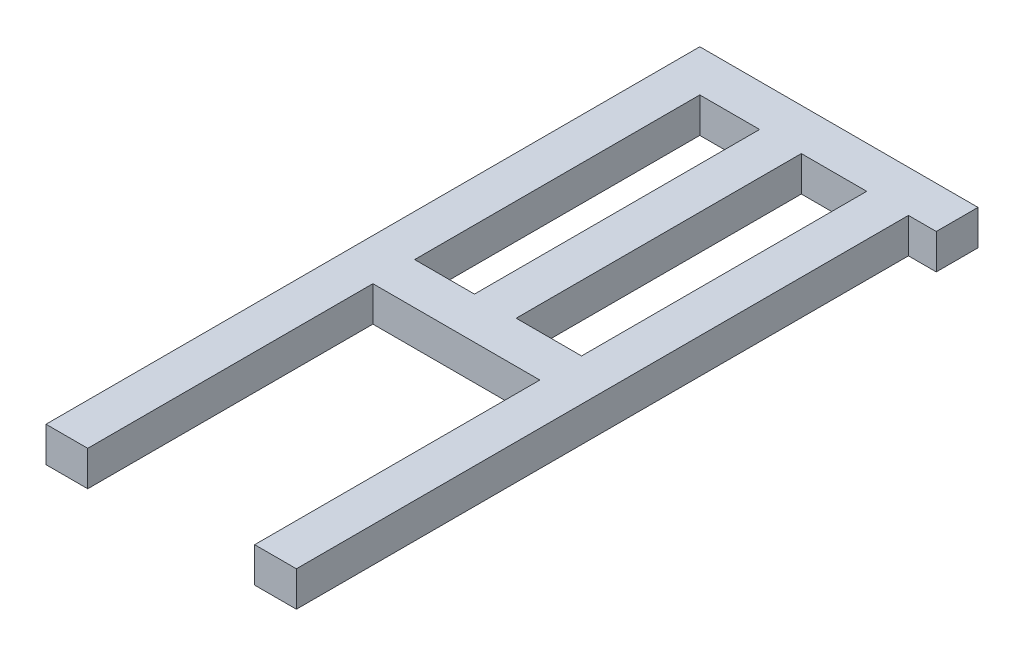
ISO-10303-21;
HEADER;
FILE_DESCRIPTION(('STEP AP214'),'2;1');
FILE_NAME('part.step','',(''),(''),'','','');
FILE_SCHEMA(('AUTOMOTIVE_DESIGN { 1 0 10303 214 1 1 1 1 }'));
ENDSEC;
DATA;
#1=APPLICATION_CONTEXT('core data for automotive mechanical design processes');
#2=APPLICATION_PROTOCOL_DEFINITION('international standard','automotive_design',2000,#1);
#3=PRODUCT_CONTEXT('',#1,'mechanical');
#4=PRODUCT('Part','Part','',(#3));
#5=PRODUCT_RELATED_PRODUCT_CATEGORY('part','',(#4));
#6=PRODUCT_DEFINITION_FORMATION('','',#4);
#7=PRODUCT_DEFINITION_CONTEXT('part definition',#1,'design');
#8=PRODUCT_DEFINITION('design','',#6,#7);
#9=PRODUCT_DEFINITION_SHAPE('','',#8);
#10=(LENGTH_UNIT() NAMED_UNIT(*) SI_UNIT(.MILLI.,.METRE.));
#11=(NAMED_UNIT(*) PLANE_ANGLE_UNIT() SI_UNIT($,.RADIAN.));
#12=(NAMED_UNIT(*) SI_UNIT($,.STERADIAN.) SOLID_ANGLE_UNIT());
#13=UNCERTAINTY_MEASURE_WITH_UNIT(LENGTH_MEASURE(1.E-05),#10,'distance_accuracy_value','');
#14=(GEOMETRIC_REPRESENTATION_CONTEXT(3) GLOBAL_UNCERTAINTY_ASSIGNED_CONTEXT((#13)) GLOBAL_UNIT_ASSIGNED_CONTEXT((#10,
#11,#12)) REPRESENTATION_CONTEXT('',''));
#15=CARTESIAN_POINT('',(0.,0.,0.));
#16=DIRECTION('',(0.,0.,1.));
#17=DIRECTION('',(1.,0.,0.));
#18=AXIS2_PLACEMENT_3D('',#15,#16,#17);
#19=CARTESIAN_POINT('',(500000.,0.,512.5));
#20=DIRECTION('',(0.,0.,-1.));
#21=DIRECTION('',(-1.,0.,0.));
#22=AXIS2_PLACEMENT_3D('',#19,#20,#21);
#23=PLANE('',#22);
#24=DIRECTION('',(-1.,0.,0.));
#25=VECTOR('',#24,1.);
#26=CARTESIAN_POINT('',(500000.,0.,512.5));
#27=LINE('',#26,#25);
#28=CARTESIAN_POINT('',(0.,0.,512.5));
#29=VERTEX_POINT('',#28);
#30=CARTESIAN_POINT('',(-117.5,0.,512.5));
#31=VERTEX_POINT('',#30);
#32=EDGE_CURVE('E260',#29,#31,#27,.T.);
#33=ORIENTED_EDGE('',*,*,#32,.T.);
#34=DIRECTION('',(0.,1.,0.));
#35=VECTOR('',#34,1.);
#36=CARTESIAN_POINT('',(-117.5,0.,512.5));
#37=LINE('',#36,#35);
#38=CARTESIAN_POINT('',(-117.5,63.,512.5));
#39=VERTEX_POINT('',#38);
#40=EDGE_CURVE('E202',#31,#39,#37,.T.);
#41=ORIENTED_EDGE('',*,*,#40,.T.);
#42=DIRECTION('',(-1.,0.,0.));
#43=VECTOR('',#42,1.);
#44=CARTESIAN_POINT('',(500000.,63.,512.5));
#45=LINE('',#44,#43);
#46=CARTESIAN_POINT('',(0.,63.,512.5));
#47=VERTEX_POINT('',#46);
#48=EDGE_CURVE('E256',#47,#39,#45,.T.);
#49=ORIENTED_EDGE('',*,*,#48,.F.);
#50=DIRECTION('',(0.,-1.,0.));
#51=VECTOR('',#50,1.);
#52=CARTESIAN_POINT('',(0.,0.,512.5));
#53=LINE('',#52,#51);
#54=EDGE_CURVE('E56',#47,#29,#53,.T.);
#55=ORIENTED_EDGE('',*,*,#54,.T.);
#56=EDGE_LOOP('',(#33,#41,#49,#55));
#57=FACE_BOUND('',#56,.T.);
#58=ADVANCED_FACE('F33',(#57),#23,.T.);
#59=CARTESIAN_POINT('',(-192.5,63.,512.5));
#60=VERTEX_POINT('',#59);
#61=CARTESIAN_POINT('',(-299.999999999955,63.,512.5));
#62=VERTEX_POINT('',#61);
#63=EDGE_CURVE('E259',#60,#62,#45,.T.);
#64=ORIENTED_EDGE('',*,*,#63,.F.);
#65=DIRECTION('',(0.,-1.,0.));
#66=VECTOR('',#65,1.);
#67=CARTESIAN_POINT('',(-192.5,0.,512.5));
#68=LINE('',#67,#66);
#69=CARTESIAN_POINT('',(-192.499999999995,0.,512.5));
#70=VERTEX_POINT('',#69);
#71=EDGE_CURVE('E205',#60,#70,#68,.T.);
#72=ORIENTED_EDGE('',*,*,#71,.T.);
#73=CARTESIAN_POINT('',(-300.,0.,512.5));
#74=VERTEX_POINT('',#73);
#75=EDGE_CURVE('E249',#70,#74,#27,.T.);
#76=ORIENTED_EDGE('',*,*,#75,.T.);
#77=DIRECTION('',(0.,-1.,0.));
#78=VECTOR('',#77,1.);
#79=CARTESIAN_POINT('',(-300.000000000011,1.10075188885363E-10,512.5));
#80=LINE('',#79,#78);
#81=EDGE_CURVE('E245',#62,#74,#80,.T.);
#82=ORIENTED_EDGE('',*,*,#81,.F.);
#83=EDGE_LOOP('',(#64,#72,#76,#82));
#84=FACE_BOUND('',#83,.T.);
#85=ADVANCED_FACE('F318',(#84),#23,.T.);
#86=CARTESIAN_POINT('',(0.,0.,1100.));
#87=DIRECTION('',(1.,0.,0.));
#88=DIRECTION('',(0.,0.,-1.));
#89=AXIS2_PLACEMENT_3D('',#86,#87,#88);
#90=PLANE('',#89);
#91=ORIENTED_EDGE('',*,*,#54,.F.);
#92=DIRECTION('',(0.,0.,-1.));
#93=VECTOR('',#92,1.);
#94=CARTESIAN_POINT('',(0.,63.,1100.));
#95=LINE('',#94,#93);
#96=CARTESIAN_POINT('',(0.,63.,0.));
#97=VERTEX_POINT('',#96);
#98=EDGE_CURVE('E278',#47,#97,#95,.T.);
#99=ORIENTED_EDGE('',*,*,#98,.T.);
#100=DIRECTION('',(0.,-1.,0.));
#101=VECTOR('',#100,1.);
#102=CARTESIAN_POINT('',(0.,0.,0.));
#103=LINE('',#102,#101);
#104=CARTESIAN_POINT('',(0.,0.,0.));
#105=VERTEX_POINT('',#104);
#106=EDGE_CURVE('E267',#97,#105,#103,.T.);
#107=ORIENTED_EDGE('',*,*,#106,.T.);
#108=DIRECTION('',(0.,0.,-1.));
#109=VECTOR('',#108,1.);
#110=CARTESIAN_POINT('',(0.,0.,1100.));
#111=LINE('',#110,#109);
#112=EDGE_CURVE('E41',#29,#105,#111,.T.);
#113=ORIENTED_EDGE('',*,*,#112,.F.);
#114=EDGE_LOOP('',(#91,#99,#107,#113));
#115=FACE_BOUND('',#114,.T.);
#116=ADVANCED_FACE('F35',(#115),#90,.F.);
#117=DIRECTION('',(0.,1.,0.));
#118=VECTOR('',#117,1.);
#119=CARTESIAN_POINT('',(0.,0.,587.5));
#120=LINE('',#119,#118);
#121=CARTESIAN_POINT('',(0.,0.,587.5));
#122=VERTEX_POINT('',#121);
#123=CARTESIAN_POINT('',(0.,63.,587.5));
#124=VERTEX_POINT('',#123);
#125=EDGE_CURVE('E264',#122,#124,#120,.T.);
#126=ORIENTED_EDGE('',*,*,#125,.F.);
#127=CARTESIAN_POINT('',(0.,0.,1100.));
#128=VERTEX_POINT('',#127);
#129=EDGE_CURVE('E11',#128,#122,#111,.T.);
#130=ORIENTED_EDGE('',*,*,#129,.F.);
#131=DIRECTION('',(0.,-1.,0.));
#132=VECTOR('',#131,1.);
#133=CARTESIAN_POINT('',(0.,0.,1100.));
#134=LINE('',#133,#132);
#135=CARTESIAN_POINT('',(0.,63.,1100.));
#136=VERTEX_POINT('',#135);
#137=EDGE_CURVE('E268',#136,#128,#134,.T.);
#138=ORIENTED_EDGE('',*,*,#137,.F.);
#139=EDGE_CURVE('E283',#136,#124,#95,.T.);
#140=ORIENTED_EDGE('',*,*,#139,.T.);
#141=EDGE_LOOP('',(#126,#130,#138,#140));
#142=FACE_BOUND('',#141,.T.);
#143=ADVANCED_FACE('F325',(#142),#90,.F.);
#144=CARTESIAN_POINT('',(0.,0.,1100.));
#145=DIRECTION('',(0.,1.,0.));
#146=DIRECTION('',(0.,0.,1.));
#147=AXIS2_PLACEMENT_3D('',#144,#145,#146);
#148=PLANE('',#147);
#149=DIRECTION('',(-1.,0.,0.));
#150=VECTOR('',#149,1.);
#151=CARTESIAN_POINT('',(125.,0.,0.));
#152=LINE('',#151,#150);
#153=CARTESIAN_POINT('',(125.,0.,0.));
#154=VERTEX_POINT('',#153);
#155=CARTESIAN_POINT('',(75.,0.,0.));
#156=VERTEX_POINT('',#155);
#157=EDGE_CURVE('E197',#154,#156,#152,.T.);
#158=ORIENTED_EDGE('',*,*,#157,.T.);
#159=DIRECTION('',(0.,0.,-1.));
#160=VECTOR('',#159,1.);
#161=CARTESIAN_POINT('',(75.,0.,1100.));
#162=LINE('',#161,#160);
#163=CARTESIAN_POINT('',(75.,0.,1100.));
#164=VERTEX_POINT('',#163);
#165=EDGE_CURVE('E286',#164,#156,#162,.T.);
#166=ORIENTED_EDGE('',*,*,#165,.F.);
#167=DIRECTION('',(1.,0.,0.));
#168=VECTOR('',#167,1.);
#169=CARTESIAN_POINT('',(0.,0.,1100.));
#170=LINE('',#169,#168);
#171=EDGE_CURVE('E271',#128,#164,#170,.T.);
#172=ORIENTED_EDGE('',*,*,#171,.F.);
#173=ORIENTED_EDGE('',*,*,#129,.T.);
#174=DIRECTION('',(-1.,0.,0.));
#175=VECTOR('',#174,1.);
#176=CARTESIAN_POINT('',(500000.,0.,587.5));
#177=LINE('',#176,#175);
#178=CARTESIAN_POINT('',(-299.999999999955,0.,587.5));
#179=VERTEX_POINT('',#178);
#180=EDGE_CURVE('E252',#122,#179,#177,.T.);
#181=ORIENTED_EDGE('',*,*,#180,.T.);
#182=DIRECTION('',(0.,0.,-1.));
#183=VECTOR('',#182,1.);
#184=CARTESIAN_POINT('',(-300.,0.,1100.));
#185=LINE('',#184,#183);
#186=CARTESIAN_POINT('',(-300.,0.,1100.));
#187=VERTEX_POINT('',#186);
#188=EDGE_CURVE('E240',#187,#179,#185,.T.);
#189=ORIENTED_EDGE('',*,*,#188,.F.);
#190=DIRECTION('',(1.,0.,0.));
#191=VECTOR('',#190,1.);
#192=CARTESIAN_POINT('',(-375.,0.,1100.));
#193=LINE('',#192,#191);
#194=CARTESIAN_POINT('',(-375.,0.,1100.));
#195=VERTEX_POINT('',#194);
#196=EDGE_CURVE('E225',#195,#187,#193,.T.);
#197=ORIENTED_EDGE('',*,*,#196,.F.);
#198=DIRECTION('',(0.,0.,-1.));
#199=VECTOR('',#198,1.);
#200=CARTESIAN_POINT('',(-375.,0.,1100.));
#201=LINE('',#200,#199);
#202=CARTESIAN_POINT('',(-375.,0.,-75.));
#203=VERTEX_POINT('',#202);
#204=EDGE_CURVE('E243',#195,#203,#201,.T.);
#205=ORIENTED_EDGE('',*,*,#204,.T.);
#206=DIRECTION('',(-1.,0.,0.));
#207=VECTOR('',#206,1.);
#208=CARTESIAN_POINT('',(125.,0.,-75.));
#209=LINE('',#208,#207);
#210=CARTESIAN_POINT('',(125.,0.,-75.));
#211=VERTEX_POINT('',#210);
#212=EDGE_CURVE('E172',#211,#203,#209,.T.);
#213=ORIENTED_EDGE('',*,*,#212,.F.);
#214=DIRECTION('',(0.,0.,-1.));
#215=VECTOR('',#214,1.);
#216=CARTESIAN_POINT('',(125.,0.,0.));
#217=LINE('',#216,#215);
#218=EDGE_CURVE('E180',#154,#211,#217,.T.);
#219=ORIENTED_EDGE('',*,*,#218,.F.);
#220=EDGE_LOOP('',(#158,#166,#172,#173,#181,#189,#197,#205,#213,#219));
#221=FACE_BOUND('',#220,.T.);
#222=CARTESIAN_POINT('',(-192.5,0.,0.));
#223=VERTEX_POINT('',#222);
#224=CARTESIAN_POINT('',(-300.,0.,0.));
#225=VERTEX_POINT('',#224);
#226=EDGE_CURVE('E200',#223,#225,#152,.T.);
#227=ORIENTED_EDGE('',*,*,#226,.T.);
#228=EDGE_CURVE('E239',#74,#225,#185,.T.);
#229=ORIENTED_EDGE('',*,*,#228,.F.);
#230=ORIENTED_EDGE('',*,*,#75,.F.);
#231=DIRECTION('',(0.,0.,-1.));
#232=VECTOR('',#231,1.);
#233=CARTESIAN_POINT('',(-192.5,0.,512.5));
#234=LINE('',#233,#232);
#235=EDGE_CURVE('E48',#70,#223,#234,.T.);
#236=ORIENTED_EDGE('',*,*,#235,.T.);
#237=EDGE_LOOP('',(#227,#229,#230,#236));
#238=FACE_BOUND('',#237,.T.);
#239=ORIENTED_EDGE('',*,*,#112,.T.);
#240=CARTESIAN_POINT('',(-117.5,0.,0.));
#241=VERTEX_POINT('',#240);
#242=EDGE_CURVE('E199',#105,#241,#152,.T.);
#243=ORIENTED_EDGE('',*,*,#242,.T.);
#244=DIRECTION('',(0.,0.,-1.));
#245=VECTOR('',#244,1.);
#246=CARTESIAN_POINT('',(-117.5,0.,512.5));
#247=LINE('',#246,#245);
#248=EDGE_CURVE('E218',#31,#241,#247,.T.);
#249=ORIENTED_EDGE('',*,*,#248,.F.);
#250=ORIENTED_EDGE('',*,*,#32,.F.);
#251=EDGE_LOOP('',(#239,#243,#249,#250));
#252=FACE_BOUND('',#251,.T.);
#253=ADVANCED_FACE('F294',(#221,#238,#252),#148,.F.);
#254=CARTESIAN_POINT('',(75.,0.,1100.));
#255=DIRECTION('',(-1.,0.,0.));
#256=DIRECTION('',(0.,-1.,0.));
#257=AXIS2_PLACEMENT_3D('',#254,#255,#256);
#258=PLANE('',#257);
#259=DIRECTION('',(0.,1.,0.));
#260=VECTOR('',#259,1.);
#261=CARTESIAN_POINT('',(75.,0.,0.));
#262=LINE('',#261,#260);
#263=CARTESIAN_POINT('',(75.,63.,0.));
#264=VERTEX_POINT('',#263);
#265=EDGE_CURVE('E272',#156,#264,#262,.T.);
#266=ORIENTED_EDGE('',*,*,#265,.T.);
#267=DIRECTION('',(0.,0.,-1.));
#268=VECTOR('',#267,1.);
#269=CARTESIAN_POINT('',(75.,63.,1100.));
#270=LINE('',#269,#268);
#271=CARTESIAN_POINT('',(75.,63.,1100.));
#272=VERTEX_POINT('',#271);
#273=EDGE_CURVE('E285',#272,#264,#270,.T.);
#274=ORIENTED_EDGE('',*,*,#273,.F.);
#275=DIRECTION('',(0.,1.,0.));
#276=VECTOR('',#275,1.);
#277=CARTESIAN_POINT('',(75.,0.,1100.));
#278=LINE('',#277,#276);
#279=EDGE_CURVE('E274',#164,#272,#278,.T.);
#280=ORIENTED_EDGE('',*,*,#279,.F.);
#281=ORIENTED_EDGE('',*,*,#165,.T.);
#282=EDGE_LOOP('',(#266,#274,#280,#281));
#283=FACE_BOUND('',#282,.T.);
#284=ADVANCED_FACE('F342',(#283),#258,.F.);
#285=CARTESIAN_POINT('',(0.,63.,1100.));
#286=DIRECTION('',(0.,-1.,0.));
#287=DIRECTION('',(0.,0.,-1.));
#288=AXIS2_PLACEMENT_3D('',#285,#286,#287);
#289=PLANE('',#288);
#290=DIRECTION('',(-1.,0.,0.));
#291=VECTOR('',#290,1.);
#292=CARTESIAN_POINT('',(125.,63.,0.));
#293=LINE('',#292,#291);
#294=CARTESIAN_POINT('',(-117.5,63.,0.));
#295=VERTEX_POINT('',#294);
#296=EDGE_CURVE('E195',#97,#295,#293,.T.);
#297=ORIENTED_EDGE('',*,*,#296,.F.);
#298=ORIENTED_EDGE('',*,*,#98,.F.);
#299=ORIENTED_EDGE('',*,*,#48,.T.);
#300=DIRECTION('',(0.,0.,-1.));
#301=VECTOR('',#300,1.);
#302=CARTESIAN_POINT('',(-117.5,63.,512.5));
#303=LINE('',#302,#301);
#304=EDGE_CURVE('E215',#39,#295,#303,.T.);
#305=ORIENTED_EDGE('',*,*,#304,.T.);
#306=EDGE_LOOP('',(#297,#298,#299,#305));
#307=FACE_BOUND('',#306,.T.);
#308=DIRECTION('',(-1.,0.,0.));
#309=VECTOR('',#308,1.);
#310=CARTESIAN_POINT('',(125.,63.,-75.));
#311=LINE('',#310,#309);
#312=CARTESIAN_POINT('',(125.,63.,-75.));
#313=VERTEX_POINT('',#312);
#314=CARTESIAN_POINT('',(-375.,63.,-75.));
#315=VERTEX_POINT('',#314);
#316=EDGE_CURVE('E162',#313,#315,#311,.T.);
#317=ORIENTED_EDGE('',*,*,#316,.T.);
#318=DIRECTION('',(0.,0.,-1.));
#319=VECTOR('',#318,1.);
#320=CARTESIAN_POINT('',(-375.,63.,1100.));
#321=LINE('',#320,#319);
#322=CARTESIAN_POINT('',(-375.,63.,1100.));
#323=VERTEX_POINT('',#322);
#324=EDGE_CURVE('E231',#323,#315,#321,.T.);
#325=ORIENTED_EDGE('',*,*,#324,.F.);
#326=DIRECTION('',(-1.,0.,0.));
#327=VECTOR('',#326,1.);
#328=CARTESIAN_POINT('',(-375.,63.,1100.));
#329=LINE('',#328,#327);
#330=CARTESIAN_POINT('',(-300.,63.,1100.));
#331=VERTEX_POINT('',#330);
#332=EDGE_CURVE('E229',#331,#323,#329,.T.);
#333=ORIENTED_EDGE('',*,*,#332,.F.);
#334=DIRECTION('',(0.,0.,-1.));
#335=VECTOR('',#334,1.);
#336=CARTESIAN_POINT('',(-300.,63.,1100.));
#337=LINE('',#336,#335);
#338=CARTESIAN_POINT('',(-300.000000000011,63.,587.5));
#339=VERTEX_POINT('',#338);
#340=EDGE_CURVE('E236',#331,#339,#337,.T.);
#341=ORIENTED_EDGE('',*,*,#340,.T.);
#342=DIRECTION('',(-1.,0.,0.));
#343=VECTOR('',#342,1.);
#344=CARTESIAN_POINT('',(500000.,63.,587.5));
#345=LINE('',#344,#343);
#346=EDGE_CURVE('E254',#124,#339,#345,.T.);
#347=ORIENTED_EDGE('',*,*,#346,.F.);
#348=ORIENTED_EDGE('',*,*,#139,.F.);
#349=DIRECTION('',(-1.,0.,0.));
#350=VECTOR('',#349,1.);
#351=CARTESIAN_POINT('',(0.,63.,1100.));
#352=LINE('',#351,#350);
#353=EDGE_CURVE('E276',#272,#136,#352,.T.);
#354=ORIENTED_EDGE('',*,*,#353,.F.);
#355=ORIENTED_EDGE('',*,*,#273,.T.);
#356=CARTESIAN_POINT('',(125.,63.,0.));
#357=VERTEX_POINT('',#356);
#358=EDGE_CURVE('E186',#357,#264,#293,.T.);
#359=ORIENTED_EDGE('',*,*,#358,.F.);
#360=DIRECTION('',(0.,0.,-1.));
#361=VECTOR('',#360,1.);
#362=CARTESIAN_POINT('',(125.,63.,0.));
#363=LINE('',#362,#361);
#364=EDGE_CURVE('E178',#357,#313,#363,.T.);
#365=ORIENTED_EDGE('',*,*,#364,.T.);
#366=EDGE_LOOP('',(#317,#325,#333,#341,#347,#348,#354,#355,#359,#365));
#367=FACE_BOUND('',#366,.T.);
#368=CARTESIAN_POINT('',(-300.,63.,0.));
#369=VERTEX_POINT('',#368);
#370=EDGE_CURVE('E235',#62,#369,#337,.T.);
#371=ORIENTED_EDGE('',*,*,#370,.T.);
#372=CARTESIAN_POINT('',(-192.5,63.,0.));
#373=VERTEX_POINT('',#372);
#374=EDGE_CURVE('E196',#373,#369,#293,.T.);
#375=ORIENTED_EDGE('',*,*,#374,.F.);
#376=DIRECTION('',(0.,0.,-1.));
#377=VECTOR('',#376,1.);
#378=CARTESIAN_POINT('',(-192.5,63.,512.5));
#379=LINE('',#378,#377);
#380=EDGE_CURVE('E212',#60,#373,#379,.T.);
#381=ORIENTED_EDGE('',*,*,#380,.F.);
#382=ORIENTED_EDGE('',*,*,#63,.T.);
#383=EDGE_LOOP('',(#371,#375,#381,#382));
#384=FACE_BOUND('',#383,.T.);
#385=ADVANCED_FACE('F183',(#307,#367,#384),#289,.F.);
#386=CARTESIAN_POINT('',(0.,0.,1100.));
#387=DIRECTION('',(0.,0.,-1.));
#388=DIRECTION('',(-1.,0.,0.));
#389=AXIS2_PLACEMENT_3D('',#386,#387,#388);
#390=PLANE('',#389);
#391=ORIENTED_EDGE('',*,*,#137,.T.);
#392=ORIENTED_EDGE('',*,*,#171,.T.);
#393=ORIENTED_EDGE('',*,*,#279,.T.);
#394=ORIENTED_EDGE('',*,*,#353,.T.);
#395=EDGE_LOOP('',(#391,#392,#393,#394));
#396=FACE_BOUND('',#395,.T.);
#397=ADVANCED_FACE('F335',(#396),#390,.F.);
#398=CARTESIAN_POINT('',(500000.,0.,587.5));
#399=DIRECTION('',(0.,0.,1.));
#400=DIRECTION('',(1.,0.,0.));
#401=AXIS2_PLACEMENT_3D('',#398,#399,#400);
#402=PLANE('',#401);
#403=ORIENTED_EDGE('',*,*,#180,.F.);
#404=ORIENTED_EDGE('',*,*,#125,.T.);
#405=ORIENTED_EDGE('',*,*,#346,.T.);
#406=DIRECTION('',(0.,1.,0.));
#407=VECTOR('',#406,1.);
#408=CARTESIAN_POINT('',(-300.000000000011,1.10079680799543E-10,587.5));
#409=LINE('',#408,#407);
#410=EDGE_CURVE('E246',#179,#339,#409,.T.);
#411=ORIENTED_EDGE('',*,*,#410,.F.);
#412=EDGE_LOOP('',(#403,#404,#405,#411));
#413=FACE_BOUND('',#412,.T.);
#414=ADVANCED_FACE('F331',(#413),#402,.T.);
#415=CARTESIAN_POINT('',(-300.,0.,1100.));
#416=DIRECTION('',(-1.,0.,0.));
#417=DIRECTION('',(0.,-1.,0.));
#418=AXIS2_PLACEMENT_3D('',#415,#416,#417);
#419=PLANE('',#418);
#420=ORIENTED_EDGE('',*,*,#188,.T.);
#421=ORIENTED_EDGE('',*,*,#410,.T.);
#422=ORIENTED_EDGE('',*,*,#340,.F.);
#423=DIRECTION('',(0.,1.,0.));
#424=VECTOR('',#423,1.);
#425=CARTESIAN_POINT('',(-300.,0.,1100.));
#426=LINE('',#425,#424);
#427=EDGE_CURVE('E227',#187,#331,#426,.T.);
#428=ORIENTED_EDGE('',*,*,#427,.F.);
#429=EDGE_LOOP('',(#420,#421,#422,#428));
#430=FACE_BOUND('',#429,.T.);
#431=ADVANCED_FACE('F334',(#430),#419,.F.);
#432=ORIENTED_EDGE('',*,*,#370,.F.);
#433=ORIENTED_EDGE('',*,*,#81,.T.);
#434=ORIENTED_EDGE('',*,*,#228,.T.);
#435=DIRECTION('',(0.,1.,0.));
#436=VECTOR('',#435,1.);
#437=CARTESIAN_POINT('',(-300.,0.,0.));
#438=LINE('',#437,#436);
#439=EDGE_CURVE('E221',#225,#369,#438,.T.);
#440=ORIENTED_EDGE('',*,*,#439,.T.);
#441=EDGE_LOOP('',(#432,#433,#434,#440));
#442=FACE_BOUND('',#441,.T.);
#443=ADVANCED_FACE('F312',(#442),#419,.F.);
#444=CARTESIAN_POINT('',(-375.,0.,1100.));
#445=DIRECTION('',(1.,0.,0.));
#446=DIRECTION('',(0.,0.,-1.));
#447=AXIS2_PLACEMENT_3D('',#444,#445,#446);
#448=PLANE('',#447);
#449=ORIENTED_EDGE('',*,*,#324,.T.);
#450=DIRECTION('',(0.,-1.,0.));
#451=VECTOR('',#450,1.);
#452=CARTESIAN_POINT('',(-375.,0.,-75.));
#453=LINE('',#452,#451);
#454=EDGE_CURVE('E168',#315,#203,#453,.T.);
#455=ORIENTED_EDGE('',*,*,#454,.T.);
#456=ORIENTED_EDGE('',*,*,#204,.F.);
#457=DIRECTION('',(0.,-1.,0.));
#458=VECTOR('',#457,1.);
#459=CARTESIAN_POINT('',(-375.,0.,1100.));
#460=LINE('',#459,#458);
#461=EDGE_CURVE('E222',#323,#195,#460,.T.);
#462=ORIENTED_EDGE('',*,*,#461,.F.);
#463=EDGE_LOOP('',(#449,#455,#456,#462));
#464=FACE_BOUND('',#463,.T.);
#465=ADVANCED_FACE('F329',(#464),#448,.F.);
#466=CARTESIAN_POINT('',(-375.,0.,1100.));
#467=DIRECTION('',(0.,0.,-1.));
#468=DIRECTION('',(-1.,0.,0.));
#469=AXIS2_PLACEMENT_3D('',#466,#467,#468);
#470=PLANE('',#469);
#471=ORIENTED_EDGE('',*,*,#461,.T.);
#472=ORIENTED_EDGE('',*,*,#196,.T.);
#473=ORIENTED_EDGE('',*,*,#427,.T.);
#474=ORIENTED_EDGE('',*,*,#332,.T.);
#475=EDGE_LOOP('',(#471,#472,#473,#474));
#476=FACE_BOUND('',#475,.T.);
#477=ADVANCED_FACE('F369',(#476),#470,.F.);
#478=CARTESIAN_POINT('',(-117.5,0.,512.5));
#479=DIRECTION('',(-1.,0.,0.));
#480=DIRECTION('',(0.,0.,1.));
#481=AXIS2_PLACEMENT_3D('',#478,#479,#480);
#482=PLANE('',#481);
#483=DIRECTION('',(0.,1.,0.));
#484=VECTOR('',#483,1.);
#485=CARTESIAN_POINT('',(-117.5,0.,0.));
#486=LINE('',#485,#484);
#487=EDGE_CURVE('E194',#241,#295,#486,.T.);
#488=ORIENTED_EDGE('',*,*,#487,.T.);
#489=ORIENTED_EDGE('',*,*,#304,.F.);
#490=ORIENTED_EDGE('',*,*,#40,.F.);
#491=ORIENTED_EDGE('',*,*,#248,.T.);
#492=EDGE_LOOP('',(#488,#489,#490,#491));
#493=FACE_BOUND('',#492,.T.);
#494=ADVANCED_FACE('F377',(#493),#482,.F.);
#495=CARTESIAN_POINT('',(-192.5,0.,512.5));
#496=DIRECTION('',(1.,0.,0.));
#497=DIRECTION('',(0.,0.,-1.));
#498=AXIS2_PLACEMENT_3D('',#495,#496,#497);
#499=PLANE('',#498);
#500=DIRECTION('',(0.,-1.,0.));
#501=VECTOR('',#500,1.);
#502=CARTESIAN_POINT('',(-192.5,0.,0.));
#503=LINE('',#502,#501);
#504=EDGE_CURVE('E206',#373,#223,#503,.T.);
#505=ORIENTED_EDGE('',*,*,#504,.T.);
#506=ORIENTED_EDGE('',*,*,#235,.F.);
#507=ORIENTED_EDGE('',*,*,#71,.F.);
#508=ORIENTED_EDGE('',*,*,#380,.T.);
#509=EDGE_LOOP('',(#505,#506,#507,#508));
#510=FACE_BOUND('',#509,.T.);
#511=ADVANCED_FACE('F316',(#510),#499,.F.);
#512=CARTESIAN_POINT('',(125.,0.,0.));
#513=DIRECTION('',(0.,0.,-1.));
#514=DIRECTION('',(-1.,0.,0.));
#515=AXIS2_PLACEMENT_3D('',#512,#513,#514);
#516=PLANE('',#515);
#517=ORIENTED_EDGE('',*,*,#242,.F.);
#518=ORIENTED_EDGE('',*,*,#106,.F.);
#519=ORIENTED_EDGE('',*,*,#296,.T.);
#520=ORIENTED_EDGE('',*,*,#487,.F.);
#521=EDGE_LOOP('',(#517,#518,#519,#520));
#522=FACE_BOUND('',#521,.T.);
#523=ADVANCED_FACE('F299',(#522),#516,.F.);
#524=ORIENTED_EDGE('',*,*,#358,.T.);
#525=ORIENTED_EDGE('',*,*,#265,.F.);
#526=ORIENTED_EDGE('',*,*,#157,.F.);
#527=DIRECTION('',(0.,-1.,0.));
#528=VECTOR('',#527,1.);
#529=CARTESIAN_POINT('',(125.,0.,0.));
#530=LINE('',#529,#528);
#531=EDGE_CURVE('E173',#357,#154,#530,.T.);
#532=ORIENTED_EDGE('',*,*,#531,.F.);
#533=EDGE_LOOP('',(#524,#525,#526,#532));
#534=FACE_BOUND('',#533,.T.);
#535=ADVANCED_FACE('F353',(#534),#516,.F.);
#536=ORIENTED_EDGE('',*,*,#374,.T.);
#537=ORIENTED_EDGE('',*,*,#439,.F.);
#538=ORIENTED_EDGE('',*,*,#226,.F.);
#539=ORIENTED_EDGE('',*,*,#504,.F.);
#540=EDGE_LOOP('',(#536,#537,#538,#539));
#541=FACE_BOUND('',#540,.T.);
#542=ADVANCED_FACE('F305',(#541),#516,.F.);
#543=CARTESIAN_POINT('',(125.,0.,-75.));
#544=DIRECTION('',(0.,0.,-1.));
#545=DIRECTION('',(0.,1.,0.));
#546=AXIS2_PLACEMENT_3D('',#543,#544,#545);
#547=PLANE('',#546);
#548=ORIENTED_EDGE('',*,*,#454,.F.);
#549=ORIENTED_EDGE('',*,*,#316,.F.);
#550=DIRECTION('',(0.,-1.,0.));
#551=VECTOR('',#550,1.);
#552=CARTESIAN_POINT('',(125.,0.,-75.));
#553=LINE('',#552,#551);
#554=EDGE_CURVE('E166',#313,#211,#553,.T.);
#555=ORIENTED_EDGE('',*,*,#554,.T.);
#556=ORIENTED_EDGE('',*,*,#212,.T.);
#557=EDGE_LOOP('',(#548,#549,#555,#556));
#558=FACE_BOUND('',#557,.T.);
#559=ADVANCED_FACE('F164',(#558),#547,.T.);
#560=CARTESIAN_POINT('',(125.,0.,0.));
#561=DIRECTION('',(-1.,0.,0.));
#562=DIRECTION('',(0.,0.,1.));
#563=AXIS2_PLACEMENT_3D('',#560,#561,#562);
#564=PLANE('',#563);
#565=ORIENTED_EDGE('',*,*,#364,.F.);
#566=ORIENTED_EDGE('',*,*,#531,.T.);
#567=ORIENTED_EDGE('',*,*,#218,.T.);
#568=ORIENTED_EDGE('',*,*,#554,.F.);
#569=EDGE_LOOP('',(#565,#566,#567,#568));
#570=FACE_BOUND('',#569,.T.);
#571=ADVANCED_FACE('F177',(#570),#564,.F.);
#572=CLOSED_SHELL('',(#58,#85,#116,#143,#253,#284,#385,#397,#414,#431,#443,#465,#477,#494,#511,
#523,#535,#542,#559,#571));
#573=MANIFOLD_SOLID_BREP('B2',#572);
#574=ADVANCED_BREP_SHAPE_REPRESENTATION('',(#18,#573),#14);
#575=SHAPE_DEFINITION_REPRESENTATION(#9,#574);
ENDSEC;
END-ISO-10303-21;
